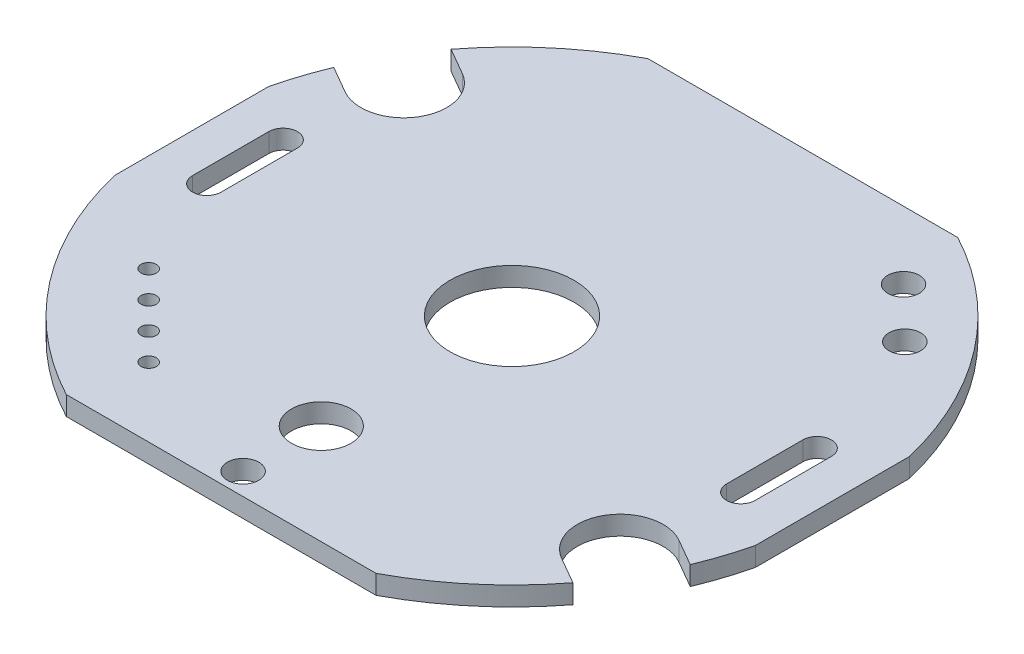
ISO-10303-21;
HEADER;
FILE_DESCRIPTION(('STEP AP214'),'2;1');
FILE_NAME('part.step','',(''),(''),'','','');
FILE_SCHEMA(('AUTOMOTIVE_DESIGN { 1 0 10303 214 1 1 1 1 }'));
ENDSEC;
DATA;
#1=APPLICATION_CONTEXT('core data for automotive mechanical design processes');
#2=APPLICATION_PROTOCOL_DEFINITION('international standard','automotive_design',2000,#1);
#3=PRODUCT_CONTEXT('',#1,'mechanical');
#4=PRODUCT('Part','Part','',(#3));
#5=PRODUCT_RELATED_PRODUCT_CATEGORY('part','',(#4));
#6=PRODUCT_DEFINITION_FORMATION('','',#4);
#7=PRODUCT_DEFINITION_CONTEXT('part definition',#1,'design');
#8=PRODUCT_DEFINITION('design','',#6,#7);
#9=PRODUCT_DEFINITION_SHAPE('','',#8);
#10=(LENGTH_UNIT() NAMED_UNIT(*) SI_UNIT(.MILLI.,.METRE.));
#11=(NAMED_UNIT(*) PLANE_ANGLE_UNIT() SI_UNIT($,.RADIAN.));
#12=(NAMED_UNIT(*) SI_UNIT($,.STERADIAN.) SOLID_ANGLE_UNIT());
#13=UNCERTAINTY_MEASURE_WITH_UNIT(LENGTH_MEASURE(1.E-05),#10,'distance_accuracy_value','');
#14=(GEOMETRIC_REPRESENTATION_CONTEXT(3) GLOBAL_UNCERTAINTY_ASSIGNED_CONTEXT((#13)) GLOBAL_UNIT_ASSIGNED_CONTEXT((#10,
#11,#12)) REPRESENTATION_CONTEXT('',''));
#15=CARTESIAN_POINT('',(0.,0.,0.));
#16=DIRECTION('',(0.,0.,1.));
#17=DIRECTION('',(1.,0.,0.));
#18=AXIS2_PLACEMENT_3D('',#15,#16,#17);
#19=CARTESIAN_POINT('',(16.8005,0.,-15.2505));
#20=DIRECTION('',(0.,1.,0.));
#21=DIRECTION('',(0.,0.,1.));
#22=AXIS2_PLACEMENT_3D('',#19,#20,#21);
#23=PLANE('',#22);
#24=CARTESIAN_POINT('',(2.8,0.,-17.25));
#25=DIRECTION('',(0.,-1.,0.));
#26=DIRECTION('',(0.,0.,-1.));
#27=AXIS2_PLACEMENT_3D('',#24,#25,#26);
#28=CIRCLE('',#27,0.750000000000001);
#29=CARTESIAN_POINT('',(3.55,0.,-17.25));
#30=VERTEX_POINT('',#29);
#31=CARTESIAN_POINT('',(2.05,0.,-17.25));
#32=VERTEX_POINT('',#31);
#33=EDGE_CURVE('E310',#30,#32,#28,.F.);
#34=ORIENTED_EDGE('',*,*,#33,.T.);
#35=DIRECTION('',(0.,0.,-1.));
#36=VECTOR('',#35,1.);
#37=CARTESIAN_POINT('',(2.05,0.,-17.25));
#38=LINE('',#37,#36);
#39=CARTESIAN_POINT('',(2.05,0.,-13.25));
#40=VERTEX_POINT('',#39);
#41=EDGE_CURVE('E317',#40,#32,#38,.T.);
#42=ORIENTED_EDGE('',*,*,#41,.F.);
#43=CARTESIAN_POINT('',(2.8,0.,-13.25));
#44=DIRECTION('',(0.,-1.,0.));
#45=DIRECTION('',(0.,0.,-1.));
#46=AXIS2_PLACEMENT_3D('',#43,#44,#45);
#47=CIRCLE('',#46,0.750000000000001);
#48=CARTESIAN_POINT('',(3.55,0.,-13.25));
#49=VERTEX_POINT('',#48);
#50=EDGE_CURVE('E306',#40,#49,#47,.F.);
#51=ORIENTED_EDGE('',*,*,#50,.T.);
#52=DIRECTION('',(0.,0.,1.));
#53=VECTOR('',#52,1.);
#54=CARTESIAN_POINT('',(3.55,0.,-17.25));
#55=LINE('',#54,#53);
#56=EDGE_CURVE('E312',#30,#49,#55,.T.);
#57=ORIENTED_EDGE('',*,*,#56,.F.);
#58=EDGE_LOOP('',(#34,#42,#51,#57));
#59=FACE_BOUND('',#58,.T.);
#60=CARTESIAN_POINT('',(9.3713,0.,-3.6287));
#61=DIRECTION('',(0.,-1.,0.));
#62=DIRECTION('',(0.,0.,-1.));
#63=AXIS2_PLACEMENT_3D('',#60,#61,#62);
#64=CIRCLE('',#63,0.4);
#65=CARTESIAN_POINT('',(9.3713,0.,-4.0287));
#66=VERTEX_POINT('',#65);
#67=EDGE_CURVE('E322',#66,#66,#64,.F.);
#68=ORIENTED_EDGE('',*,*,#67,.T.);
#69=EDGE_LOOP('',(#68));
#70=FACE_BOUND('',#69,.T.);
#71=CARTESIAN_POINT('',(7.9571,0.,-5.0429));
#72=DIRECTION('',(0.,-1.,0.));
#73=DIRECTION('',(0.,0.,-1.));
#74=AXIS2_PLACEMENT_3D('',#71,#72,#73);
#75=CIRCLE('',#74,0.399999999999999);
#76=CARTESIAN_POINT('',(7.9571,0.,-5.4429));
#77=VERTEX_POINT('',#76);
#78=EDGE_CURVE('E19',#77,#77,#75,.F.);
#79=ORIENTED_EDGE('',*,*,#78,.T.);
#80=EDGE_LOOP('',(#79));
#81=FACE_BOUND('',#80,.T.);
#82=CARTESIAN_POINT('',(6.5429,0.,-6.4571));
#83=DIRECTION('',(0.,-1.,0.));
#84=DIRECTION('',(0.,0.,-1.));
#85=AXIS2_PLACEMENT_3D('',#82,#83,#84);
#86=CIRCLE('',#85,0.4);
#87=CARTESIAN_POINT('',(6.5429,0.,-6.8571));
#88=VERTEX_POINT('',#87);
#89=EDGE_CURVE('E326',#88,#88,#86,.F.);
#90=ORIENTED_EDGE('',*,*,#89,.T.);
#91=EDGE_LOOP('',(#90));
#92=FACE_BOUND('',#91,.T.);
#93=CARTESIAN_POINT('',(5.1287,0.,-7.8713));
#94=DIRECTION('',(0.,-1.,0.));
#95=DIRECTION('',(0.,0.,-1.));
#96=AXIS2_PLACEMENT_3D('',#93,#94,#95);
#97=CIRCLE('',#96,0.399999999999999);
#98=CARTESIAN_POINT('',(5.1287,0.,-8.2713));
#99=VERTEX_POINT('',#98);
#100=EDGE_CURVE('E352',#99,#99,#97,.F.);
#101=ORIENTED_EDGE('',*,*,#100,.T.);
#102=EDGE_LOOP('',(#101));
#103=FACE_BOUND('',#102,.T.);
#104=CARTESIAN_POINT('',(28.269335274221,0.,-24.3788193190534));
#105=DIRECTION('',(0.,-1.,0.));
#106=DIRECTION('',(0.,0.,-1.));
#107=AXIS2_PLACEMENT_3D('',#104,#105,#106);
#108=CIRCLE('',#107,0.824999999999999);
#109=CARTESIAN_POINT('',(28.269335274221,0.,-25.2038193190534));
#110=VERTEX_POINT('',#109);
#111=EDGE_CURVE('E329',#110,#110,#108,.F.);
#112=ORIENTED_EDGE('',*,*,#111,.T.);
#113=EDGE_LOOP('',(#112));
#114=FACE_BOUND('',#113,.T.);
#115=CARTESIAN_POINT('',(25.6262960708677,0.,-26.9537354438111));
#116=DIRECTION('',(0.,-1.,0.));
#117=DIRECTION('',(0.,0.,-1.));
#118=AXIS2_PLACEMENT_3D('',#115,#116,#117);
#119=CIRCLE('',#118,0.824999999999996);
#120=CARTESIAN_POINT('',(25.6262960708677,0.,-27.7787354438111));
#121=VERTEX_POINT('',#120);
#122=EDGE_CURVE('E350',#121,#121,#119,.F.);
#123=ORIENTED_EDGE('',*,*,#122,.T.);
#124=EDGE_LOOP('',(#123));
#125=FACE_BOUND('',#124,.T.);
#126=CARTESIAN_POINT('',(16.8,0.,-1.1509));
#127=DIRECTION('',(0.,-1.,0.));
#128=DIRECTION('',(0.,0.,-1.));
#129=AXIS2_PLACEMENT_3D('',#126,#127,#128);
#130=CIRCLE('',#129,0.8255);
#131=CARTESIAN_POINT('',(16.8,0.,-1.9764));
#132=VERTEX_POINT('',#131);
#133=EDGE_CURVE('E202',#132,#132,#130,.F.);
#134=ORIENTED_EDGE('',*,*,#133,.T.);
#135=EDGE_LOOP('',(#134));
#136=FACE_BOUND('',#135,.T.);
#137=CARTESIAN_POINT('',(16.8005,0.,-5.2506));
#138=DIRECTION('',(0.,-1.,0.));
#139=DIRECTION('',(0.,0.,-1.));
#140=AXIS2_PLACEMENT_3D('',#137,#138,#139);
#141=CIRCLE('',#140,1.5621);
#142=CARTESIAN_POINT('',(16.8005,0.,-6.8127));
#143=VERTEX_POINT('',#142);
#144=EDGE_CURVE('E186',#143,#143,#141,.F.);
#145=ORIENTED_EDGE('',*,*,#144,.T.);
#146=EDGE_LOOP('',(#145));
#147=FACE_BOUND('',#146,.T.);
#148=CARTESIAN_POINT('',(16.8005,0.,-15.2505));
#149=DIRECTION('',(0.,-1.,0.));
#150=DIRECTION('',(0.,0.,-1.));
#151=AXIS2_PLACEMENT_3D('',#148,#149,#150);
#152=CIRCLE('',#151,3.2512);
#153=CARTESIAN_POINT('',(16.8005,0.,-18.5017));
#154=VERTEX_POINT('',#153);
#155=EDGE_CURVE('E199',#154,#154,#152,.F.);
#156=ORIENTED_EDGE('',*,*,#155,.T.);
#157=EDGE_LOOP('',(#156));
#158=FACE_BOUND('',#157,.T.);
#159=DIRECTION('',(1.,0.,0.));
#160=VECTOR('',#159,1.);
#161=CARTESIAN_POINT('',(8.67927374070246,0.,-30.5007));
#162=LINE('',#161,#160);
#163=CARTESIAN_POINT('',(8.67927374070246,0.,-30.5007));
#164=VERTEX_POINT('',#163);
#165=CARTESIAN_POINT('',(24.9217262592976,0.,-30.5007));
#166=VERTEX_POINT('',#165);
#167=EDGE_CURVE('E179',#164,#166,#162,.T.);
#168=ORIENTED_EDGE('',*,*,#167,.T.);
#169=CARTESIAN_POINT('',(16.8005,0.,-15.2505));
#170=DIRECTION('',(0.,-1.,0.));
#171=DIRECTION('',(0.,0.,-1.));
#172=AXIS2_PLACEMENT_3D('',#169,#170,#171);
#173=CIRCLE('',#172,17.277815718276);
#174=CARTESIAN_POINT('',(33.6001,0.,-19.2873745131233));
#175=VERTEX_POINT('',#174);
#176=EDGE_CURVE('E211',#175,#166,#173,.F.);
#177=ORIENTED_EDGE('',*,*,#176,.F.);
#178=DIRECTION('',(0.,0.,1.));
#179=VECTOR('',#178,1.);
#180=CARTESIAN_POINT('',(33.6001,0.,-19.2873745131233));
#181=LINE('',#180,#179);
#182=CARTESIAN_POINT('',(33.6001,0.,-11.2136254868767));
#183=VERTEX_POINT('',#182);
#184=EDGE_CURVE('E208',#175,#183,#181,.T.);
#185=ORIENTED_EDGE('',*,*,#184,.T.);
#186=CARTESIAN_POINT('',(16.8005,0.,-15.2505));
#187=DIRECTION('',(0.,-1.,0.));
#188=DIRECTION('',(0.,0.,-1.));
#189=AXIS2_PLACEMENT_3D('',#186,#187,#188);
#190=CIRCLE('',#189,17.277815718276);
#191=CARTESIAN_POINT('',(32.7617691427317,0.,-8.63530511640165));
#192=VERTEX_POINT('',#191);
#193=EDGE_CURVE('E216',#192,#183,#190,.F.);
#194=ORIENTED_EDGE('',*,*,#193,.F.);
#195=DIRECTION('',(-0.866030773137072,0.,-0.499990699893113));
#196=VECTOR('',#195,1.);
#197=CARTESIAN_POINT('',(31.3526109768806,0.,-9.44886278601168));
#198=LINE('',#197,#196);
#199=CARTESIAN_POINT('',(31.3526109768806,0.,-9.44886278601168));
#200=VERTEX_POINT('',#199);
#201=EDGE_CURVE('E213',#192,#200,#198,.T.);
#202=ORIENTED_EDGE('',*,*,#201,.T.);
#203=CARTESIAN_POINT('',(30.2268700211117,0.,-7.49897389710827));
#204=DIRECTION('',(0.,-1.,0.));
#205=DIRECTION('',(0.,0.,-1.));
#206=AXIS2_PLACEMENT_3D('',#203,#204,#205);
#207=CIRCLE('',#206,2.25152379036166);
#208=CARTESIAN_POINT('',(29.1011290653428,0.,-5.54908500820485));
#209=VERTEX_POINT('',#208);
#210=EDGE_CURVE('E338',#200,#209,#207,.F.);
#211=ORIENTED_EDGE('',*,*,#210,.T.);
#212=DIRECTION('',(0.866030773137073,0.,0.499990699893112));
#213=VECTOR('',#212,1.);
#214=CARTESIAN_POINT('',(29.1011290653428,0.,-5.54908500820485));
#215=LINE('',#214,#213);
#216=CARTESIAN_POINT('',(30.5102872311938,0.,-4.73552733859481));
#217=VERTEX_POINT('',#216);
#218=EDGE_CURVE('E218',#209,#217,#215,.T.);
#219=ORIENTED_EDGE('',*,*,#218,.T.);
#220=CARTESIAN_POINT('',(16.8005,0.,-15.2505));
#221=DIRECTION('',(0.,-1.,0.));
#222=DIRECTION('',(0.,0.,-1.));
#223=AXIS2_PLACEMENT_3D('',#220,#221,#222);
#224=CIRCLE('',#223,17.277815718276);
#225=CARTESIAN_POINT('',(24.9217262592975,0.,-0.000299999999999953));
#226=VERTEX_POINT('',#225);
#227=EDGE_CURVE('E226',#226,#217,#224,.F.);
#228=ORIENTED_EDGE('',*,*,#227,.F.);
#229=DIRECTION('',(-1.,0.,0.));
#230=VECTOR('',#229,1.);
#231=CARTESIAN_POINT('',(24.9217262592975,0.,-0.000299999999999953));
#232=LINE('',#231,#230);
#233=CARTESIAN_POINT('',(8.67927374070247,0.,-0.000299999999999953));
#234=VERTEX_POINT('',#233);
#235=EDGE_CURVE('E223',#226,#234,#232,.T.);
#236=ORIENTED_EDGE('',*,*,#235,.T.);
#237=CARTESIAN_POINT('',(16.8005,0.,-15.2505));
#238=DIRECTION('',(0.,-1.,0.));
#239=DIRECTION('',(0.,0.,-1.));
#240=AXIS2_PLACEMENT_3D('',#237,#238,#239);
#241=CIRCLE('',#240,17.277815718276);
#242=CARTESIAN_POINT('',(0.000900000000001594,0.,-11.2136254868768));
#243=VERTEX_POINT('',#242);
#244=EDGE_CURVE('E231',#243,#234,#241,.F.);
#245=ORIENTED_EDGE('',*,*,#244,.F.);
#246=DIRECTION('',(0.,0.,-1.));
#247=VECTOR('',#246,1.);
#248=CARTESIAN_POINT('',(0.000900000000001594,0.,-19.2873745131232));
#249=LINE('',#248,#247);
#250=CARTESIAN_POINT('',(0.000900000000001594,0.,-19.2873745131232));
#251=VERTEX_POINT('',#250);
#252=EDGE_CURVE('E228',#243,#251,#249,.T.);
#253=ORIENTED_EDGE('',*,*,#252,.T.);
#254=CARTESIAN_POINT('',(16.8005,0.,-15.2505));
#255=DIRECTION('',(0.,-1.,0.));
#256=DIRECTION('',(0.,0.,-1.));
#257=AXIS2_PLACEMENT_3D('',#254,#255,#256);
#258=CIRCLE('',#257,17.277815718276);
#259=CARTESIAN_POINT('',(0.839230857268334,0.,-21.8656948835984));
#260=VERTEX_POINT('',#259);
#261=EDGE_CURVE('E236',#260,#251,#258,.F.);
#262=ORIENTED_EDGE('',*,*,#261,.F.);
#263=DIRECTION('',(0.866030773137072,0.,0.499990699893114));
#264=VECTOR('',#263,1.);
#265=CARTESIAN_POINT('',(2.24838902311941,0.,-21.0521372139883));
#266=LINE('',#265,#264);
#267=CARTESIAN_POINT('',(2.24838902311941,0.,-21.0521372139883));
#268=VERTEX_POINT('',#267);
#269=EDGE_CURVE('E233',#260,#268,#266,.T.);
#270=ORIENTED_EDGE('',*,*,#269,.T.);
#271=CARTESIAN_POINT('',(3.37412997888833,0.,-23.0020261028917));
#272=DIRECTION('',(0.,-1.,0.));
#273=DIRECTION('',(0.,0.,-1.));
#274=AXIS2_PLACEMENT_3D('',#271,#272,#273);
#275=CIRCLE('',#274,2.25152379036166);
#276=CARTESIAN_POINT('',(4.49987093465725,0.,-24.9519149917952));
#277=VERTEX_POINT('',#276);
#278=EDGE_CURVE('E346',#268,#277,#275,.F.);
#279=ORIENTED_EDGE('',*,*,#278,.T.);
#280=DIRECTION('',(-0.866030773137076,0.,-0.499990699893107));
#281=VECTOR('',#280,1.);
#282=CARTESIAN_POINT('',(4.49987093465726,0.,-24.9519149917952));
#283=LINE('',#282,#281);
#284=CARTESIAN_POINT('',(3.09071276880618,0.,-25.7654726614052));
#285=VERTEX_POINT('',#284);
#286=EDGE_CURVE('E182',#277,#285,#283,.T.);
#287=ORIENTED_EDGE('',*,*,#286,.T.);
#288=CARTESIAN_POINT('',(16.8005,0.,-15.2505));
#289=DIRECTION('',(0.,-1.,0.));
#290=DIRECTION('',(0.,0.,-1.));
#291=AXIS2_PLACEMENT_3D('',#288,#289,#290);
#292=CIRCLE('',#291,17.277815718276);
#293=EDGE_CURVE('E175',#164,#285,#292,.F.);
#294=ORIENTED_EDGE('',*,*,#293,.F.);
#295=EDGE_LOOP('',(#168,#177,#185,#194,#202,#211,#219,#228,#236,#245,#253,#262,#270,#279,#287,#294));
#296=FACE_BOUND('',#295,.T.);
#297=CARTESIAN_POINT('',(30.8,0.,-17.25));
#298=DIRECTION('',(0.,-1.,0.));
#299=DIRECTION('',(0.,0.,-1.));
#300=AXIS2_PLACEMENT_3D('',#297,#298,#299);
#301=CIRCLE('',#300,0.750000000000004);
#302=CARTESIAN_POINT('',(31.55,0.,-17.25));
#303=VERTEX_POINT('',#302);
#304=CARTESIAN_POINT('',(30.05,0.,-17.25));
#305=VERTEX_POINT('',#304);
#306=EDGE_CURVE('E319',#303,#305,#301,.F.);
#307=ORIENTED_EDGE('',*,*,#306,.T.);
#308=DIRECTION('',(0.,0.,-1.));
#309=VECTOR('',#308,1.);
#310=CARTESIAN_POINT('',(30.05,0.,-17.25));
#311=LINE('',#310,#309);
#312=CARTESIAN_POINT('',(30.05,0.,-13.25));
#313=VERTEX_POINT('',#312);
#314=EDGE_CURVE('E325',#313,#305,#311,.T.);
#315=ORIENTED_EDGE('',*,*,#314,.F.);
#316=CARTESIAN_POINT('',(30.8,0.,-13.25));
#317=DIRECTION('',(0.,-1.,0.));
#318=DIRECTION('',(0.,0.,-1.));
#319=AXIS2_PLACEMENT_3D('',#316,#317,#318);
#320=CIRCLE('',#319,0.750000000000004);
#321=CARTESIAN_POINT('',(31.55,0.,-13.25));
#322=VERTEX_POINT('',#321);
#323=EDGE_CURVE('E314',#313,#322,#320,.F.);
#324=ORIENTED_EDGE('',*,*,#323,.T.);
#325=DIRECTION('',(0.,0.,1.));
#326=VECTOR('',#325,1.);
#327=CARTESIAN_POINT('',(31.55,0.,-17.25));
#328=LINE('',#327,#326);
#329=EDGE_CURVE('E206',#303,#322,#328,.T.);
#330=ORIENTED_EDGE('',*,*,#329,.F.);
#331=EDGE_LOOP('',(#307,#315,#324,#330));
#332=FACE_BOUND('',#331,.T.);
#333=ADVANCED_FACE('F16',(#59,#70,#81,#92,#103,#114,#125,#136,#147,#158,#296,#332),#23,.F.);
#334=CARTESIAN_POINT('',(7.9571,1.,-5.0429));
#335=DIRECTION('',(0.,-1.,0.));
#336=DIRECTION('',(0.,0.,-1.));
#337=AXIS2_PLACEMENT_3D('',#334,#335,#336);
#338=CYLINDRICAL_SURFACE('',#337,0.399999999999999);
#339=CARTESIAN_POINT('',(7.9571,1.,-5.0429));
#340=DIRECTION('',(0.,-1.,0.));
#341=DIRECTION('',(0.,0.,-1.));
#342=AXIS2_PLACEMENT_3D('',#339,#340,#341);
#343=CIRCLE('',#342,0.399999999999999);
#344=CARTESIAN_POINT('',(7.9571,1.,-5.4429));
#345=VERTEX_POINT('',#344);
#346=EDGE_CURVE('E303',#345,#345,#343,.T.);
#347=ORIENTED_EDGE('',*,*,#346,.F.);
#348=EDGE_LOOP('',(#347));
#349=FACE_BOUND('',#348,.T.);
#350=ORIENTED_EDGE('',*,*,#78,.F.);
#351=EDGE_LOOP('',(#350));
#352=FACE_BOUND('',#351,.T.);
#353=ADVANCED_FACE('F361',(#349,#352),#338,.F.);
#354=CARTESIAN_POINT('',(5.1287,1.,-7.8713));
#355=DIRECTION('',(0.,-1.,0.));
#356=DIRECTION('',(0.,0.,-1.));
#357=AXIS2_PLACEMENT_3D('',#354,#355,#356);
#358=CYLINDRICAL_SURFACE('',#357,0.399999999999999);
#359=CARTESIAN_POINT('',(5.1287,1.,-7.8713));
#360=DIRECTION('',(0.,-1.,0.));
#361=DIRECTION('',(0.,0.,-1.));
#362=AXIS2_PLACEMENT_3D('',#359,#360,#361);
#363=CIRCLE('',#362,0.399999999999999);
#364=CARTESIAN_POINT('',(5.1287,1.,-8.2713));
#365=VERTEX_POINT('',#364);
#366=EDGE_CURVE('E300',#365,#365,#363,.T.);
#367=ORIENTED_EDGE('',*,*,#366,.F.);
#368=EDGE_LOOP('',(#367));
#369=FACE_BOUND('',#368,.T.);
#370=ORIENTED_EDGE('',*,*,#100,.F.);
#371=EDGE_LOOP('',(#370));
#372=FACE_BOUND('',#371,.T.);
#373=ADVANCED_FACE('F363',(#369,#372),#358,.F.);
#374=CARTESIAN_POINT('',(25.6262960708677,1.,-26.9537354438111));
#375=DIRECTION('',(0.,-1.,0.));
#376=DIRECTION('',(0.,0.,-1.));
#377=AXIS2_PLACEMENT_3D('',#374,#375,#376);
#378=CYLINDRICAL_SURFACE('',#377,0.824999999999996);
#379=CARTESIAN_POINT('',(25.6262960708677,1.,-26.9537354438111));
#380=DIRECTION('',(0.,-1.,0.));
#381=DIRECTION('',(0.,0.,-1.));
#382=AXIS2_PLACEMENT_3D('',#379,#380,#381);
#383=CIRCLE('',#382,0.824999999999996);
#384=CARTESIAN_POINT('',(25.6262960708677,1.,-27.7787354438111));
#385=VERTEX_POINT('',#384);
#386=EDGE_CURVE('E297',#385,#385,#383,.T.);
#387=ORIENTED_EDGE('',*,*,#386,.F.);
#388=EDGE_LOOP('',(#387));
#389=FACE_BOUND('',#388,.T.);
#390=ORIENTED_EDGE('',*,*,#122,.F.);
#391=EDGE_LOOP('',(#390));
#392=FACE_BOUND('',#391,.T.);
#393=ADVANCED_FACE('F370',(#389,#392),#378,.F.);
#394=CARTESIAN_POINT('',(16.8005,1.,-5.2506));
#395=DIRECTION('',(0.,-1.,0.));
#396=DIRECTION('',(0.,0.,-1.));
#397=AXIS2_PLACEMENT_3D('',#394,#395,#396);
#398=CYLINDRICAL_SURFACE('',#397,1.5621);
#399=CARTESIAN_POINT('',(16.8005,1.,-5.2506));
#400=DIRECTION('',(0.,-1.,0.));
#401=DIRECTION('',(0.,0.,-1.));
#402=AXIS2_PLACEMENT_3D('',#399,#400,#401);
#403=CIRCLE('',#402,1.5621);
#404=CARTESIAN_POINT('',(16.8005,1.,-6.8127));
#405=VERTEX_POINT('',#404);
#406=EDGE_CURVE('E294',#405,#405,#403,.T.);
#407=ORIENTED_EDGE('',*,*,#406,.F.);
#408=EDGE_LOOP('',(#407));
#409=FACE_BOUND('',#408,.T.);
#410=ORIENTED_EDGE('',*,*,#144,.F.);
#411=EDGE_LOOP('',(#410));
#412=FACE_BOUND('',#411,.T.);
#413=ADVANCED_FACE('F495',(#409,#412),#398,.F.);
#414=CARTESIAN_POINT('',(16.8005,1.,-15.2505));
#415=DIRECTION('',(0.,-1.,0.));
#416=DIRECTION('',(0.,0.,-1.));
#417=AXIS2_PLACEMENT_3D('',#414,#415,#416);
#418=CYLINDRICAL_SURFACE('',#417,17.277815718276);
#419=CARTESIAN_POINT('',(16.8005,1.,-15.2505));
#420=DIRECTION('',(0.,-1.,0.));
#421=DIRECTION('',(0.,0.,-1.));
#422=AXIS2_PLACEMENT_3D('',#419,#420,#421);
#423=CIRCLE('',#422,17.277815718276);
#424=CARTESIAN_POINT('',(8.67927374070246,1.,-30.5007));
#425=VERTEX_POINT('',#424);
#426=CARTESIAN_POINT('',(3.09071276880617,1.,-25.7654726614052));
#427=VERTEX_POINT('',#426);
#428=EDGE_CURVE('E192',#425,#427,#423,.F.);
#429=ORIENTED_EDGE('',*,*,#428,.F.);
#430=DIRECTION('',(0.,1.,0.));
#431=VECTOR('',#430,1.);
#432=CARTESIAN_POINT('',(8.67927374070246,1.,-30.5007));
#433=LINE('',#432,#431);
#434=EDGE_CURVE('E189',#425,#164,#433,.F.);
#435=ORIENTED_EDGE('',*,*,#434,.T.);
#436=ORIENTED_EDGE('',*,*,#293,.T.);
#437=DIRECTION('',(0.,1.,0.));
#438=VECTOR('',#437,1.);
#439=CARTESIAN_POINT('',(3.09071276880618,1.,-25.7654726614052));
#440=LINE('',#439,#438);
#441=EDGE_CURVE('E185',#285,#427,#440,.T.);
#442=ORIENTED_EDGE('',*,*,#441,.T.);
#443=EDGE_LOOP('',(#429,#435,#436,#442));
#444=FACE_BOUND('',#443,.T.);
#445=ADVANCED_FACE('F190',(#444),#418,.T.);
#446=CARTESIAN_POINT('',(4.49987093465726,1.,-24.9519149917952));
#447=DIRECTION('',(0.499990699893107,0.,-0.866030773137076));
#448=DIRECTION('',(-0.866030773137076,0.,-0.499990699893107));
#449=AXIS2_PLACEMENT_3D('',#446,#447,#448);
#450=PLANE('',#449);
#451=DIRECTION('',(0.,-1.,0.));
#452=VECTOR('',#451,1.);
#453=CARTESIAN_POINT('',(4.49987093465726,1.,-24.9519149917952));
#454=LINE('',#453,#452);
#455=CARTESIAN_POINT('',(4.49987093465725,1.,-24.9519149917952));
#456=VERTEX_POINT('',#455);
#457=EDGE_CURVE('E238',#277,#456,#454,.F.);
#458=ORIENTED_EDGE('',*,*,#457,.T.);
#459=DIRECTION('',(0.866030773137077,0.,0.499990699893105));
#460=VECTOR('',#459,1.);
#461=CARTESIAN_POINT('',(3.09071276880617,1.,-25.7654726614052));
#462=LINE('',#461,#460);
#463=EDGE_CURVE('E292',#427,#456,#462,.T.);
#464=ORIENTED_EDGE('',*,*,#463,.F.);
#465=ORIENTED_EDGE('',*,*,#441,.F.);
#466=ORIENTED_EDGE('',*,*,#286,.F.);
#467=EDGE_LOOP('',(#458,#464,#465,#466));
#468=FACE_BOUND('',#467,.T.);
#469=ADVANCED_FACE('F488',(#468),#450,.F.);
#470=CARTESIAN_POINT('',(3.37412997888833,1.,-23.0020261028917));
#471=DIRECTION('',(0.,-1.,0.));
#472=DIRECTION('',(0.,0.,-1.));
#473=AXIS2_PLACEMENT_3D('',#470,#471,#472);
#474=CYLINDRICAL_SURFACE('',#473,2.25152379036166);
#475=DIRECTION('',(0.,1.,0.));
#476=VECTOR('',#475,1.);
#477=CARTESIAN_POINT('',(2.24838902311941,1.,-21.0521372139883));
#478=LINE('',#477,#476);
#479=CARTESIAN_POINT('',(2.24838902311941,1.,-21.0521372139883));
#480=VERTEX_POINT('',#479);
#481=EDGE_CURVE('E237',#268,#480,#478,.T.);
#482=ORIENTED_EDGE('',*,*,#481,.T.);
#483=CARTESIAN_POINT('',(3.37412997888833,1.,-23.0020261028917));
#484=DIRECTION('',(0.,-1.,0.));
#485=DIRECTION('',(0.,0.,-1.));
#486=AXIS2_PLACEMENT_3D('',#483,#484,#485);
#487=CIRCLE('',#486,2.25152379036166);
#488=EDGE_CURVE('E289',#456,#480,#487,.T.);
#489=ORIENTED_EDGE('',*,*,#488,.F.);
#490=ORIENTED_EDGE('',*,*,#457,.F.);
#491=ORIENTED_EDGE('',*,*,#278,.F.);
#492=EDGE_LOOP('',(#482,#489,#490,#491));
#493=FACE_BOUND('',#492,.T.);
#494=ADVANCED_FACE('F484',(#493),#474,.F.);
#495=CARTESIAN_POINT('',(2.24838902311941,1.,-21.0521372139883));
#496=DIRECTION('',(-0.499990699893114,0.,0.866030773137072));
#497=DIRECTION('',(0.866030773137072,0.,0.499990699893114));
#498=AXIS2_PLACEMENT_3D('',#495,#496,#497);
#499=PLANE('',#498);
#500=DIRECTION('',(0.,-1.,0.));
#501=VECTOR('',#500,1.);
#502=CARTESIAN_POINT('',(0.839230857268333,1.,-21.8656948835983));
#503=LINE('',#502,#501);
#504=CARTESIAN_POINT('',(0.839230857268333,1.,-21.8656948835984));
#505=VERTEX_POINT('',#504);
#506=EDGE_CURVE('E345',#505,#260,#503,.T.);
#507=ORIENTED_EDGE('',*,*,#506,.F.);
#508=DIRECTION('',(-0.866030773137072,0.,-0.499990699893113));
#509=VECTOR('',#508,1.);
#510=CARTESIAN_POINT('',(2.24838902311941,1.,-21.0521372139883));
#511=LINE('',#510,#509);
#512=EDGE_CURVE('E288',#480,#505,#511,.T.);
#513=ORIENTED_EDGE('',*,*,#512,.F.);
#514=ORIENTED_EDGE('',*,*,#481,.F.);
#515=ORIENTED_EDGE('',*,*,#269,.F.);
#516=EDGE_LOOP('',(#507,#513,#514,#515));
#517=FACE_BOUND('',#516,.T.);
#518=ADVANCED_FACE('F480',(#517),#499,.F.);
#519=CARTESIAN_POINT('',(16.8005,1.,-15.2505));
#520=DIRECTION('',(0.,-1.,0.));
#521=DIRECTION('',(0.,0.,-1.));
#522=AXIS2_PLACEMENT_3D('',#519,#520,#521);
#523=CYLINDRICAL_SURFACE('',#522,17.277815718276);
#524=CARTESIAN_POINT('',(16.8005,1.,-15.2505));
#525=DIRECTION('',(0.,-1.,0.));
#526=DIRECTION('',(0.,0.,-1.));
#527=AXIS2_PLACEMENT_3D('',#524,#525,#526);
#528=CIRCLE('',#527,17.277815718276);
#529=CARTESIAN_POINT('',(0.000900000000001594,1.,-19.2873745131232));
#530=VERTEX_POINT('',#529);
#531=EDGE_CURVE('E285',#505,#530,#528,.F.);
#532=ORIENTED_EDGE('',*,*,#531,.F.);
#533=ORIENTED_EDGE('',*,*,#506,.T.);
#534=ORIENTED_EDGE('',*,*,#261,.T.);
#535=DIRECTION('',(0.,1.,0.));
#536=VECTOR('',#535,1.);
#537=CARTESIAN_POINT('',(0.000900000000001594,1.,-19.2873745131232));
#538=LINE('',#537,#536);
#539=EDGE_CURVE('E232',#251,#530,#538,.T.);
#540=ORIENTED_EDGE('',*,*,#539,.T.);
#541=EDGE_LOOP('',(#532,#533,#534,#540));
#542=FACE_BOUND('',#541,.T.);
#543=ADVANCED_FACE('F476',(#542),#523,.T.);
#544=CARTESIAN_POINT('',(0.000900000000001594,1.,-19.2873745131232));
#545=DIRECTION('',(1.,0.,0.));
#546=DIRECTION('',(0.,0.,-1.));
#547=AXIS2_PLACEMENT_3D('',#544,#545,#546);
#548=PLANE('',#547);
#549=DIRECTION('',(0.,-1.,0.));
#550=VECTOR('',#549,1.);
#551=CARTESIAN_POINT('',(0.000900000000001594,1.,-11.2136254868768));
#552=LINE('',#551,#550);
#553=CARTESIAN_POINT('',(0.000900000000001594,1.,-11.2136254868768));
#554=VERTEX_POINT('',#553);
#555=EDGE_CURVE('E343',#554,#243,#552,.T.);
#556=ORIENTED_EDGE('',*,*,#555,.F.);
#557=DIRECTION('',(0.,0.,1.));
#558=VECTOR('',#557,1.);
#559=CARTESIAN_POINT('',(0.000900000000001594,1.,-15.2505));
#560=LINE('',#559,#558);
#561=EDGE_CURVE('E284',#530,#554,#560,.T.);
#562=ORIENTED_EDGE('',*,*,#561,.F.);
#563=ORIENTED_EDGE('',*,*,#539,.F.);
#564=ORIENTED_EDGE('',*,*,#252,.F.);
#565=EDGE_LOOP('',(#556,#562,#563,#564));
#566=FACE_BOUND('',#565,.T.);
#567=ADVANCED_FACE('F472',(#566),#548,.F.);
#568=CARTESIAN_POINT('',(16.8005,1.,-15.2505));
#569=DIRECTION('',(0.,-1.,0.));
#570=DIRECTION('',(0.,0.,-1.));
#571=AXIS2_PLACEMENT_3D('',#568,#569,#570);
#572=CYLINDRICAL_SURFACE('',#571,17.277815718276);
#573=CARTESIAN_POINT('',(16.8005,1.,-15.2505));
#574=DIRECTION('',(0.,-1.,0.));
#575=DIRECTION('',(0.,0.,-1.));
#576=AXIS2_PLACEMENT_3D('',#573,#574,#575);
#577=CIRCLE('',#576,17.277815718276);
#578=CARTESIAN_POINT('',(8.67927374070247,1.,-0.000299999999999953));
#579=VERTEX_POINT('',#578);
#580=EDGE_CURVE('E281',#554,#579,#577,.F.);
#581=ORIENTED_EDGE('',*,*,#580,.F.);
#582=ORIENTED_EDGE('',*,*,#555,.T.);
#583=ORIENTED_EDGE('',*,*,#244,.T.);
#584=DIRECTION('',(0.,1.,0.));
#585=VECTOR('',#584,1.);
#586=CARTESIAN_POINT('',(8.67927374070247,1.,-0.000299999999999953));
#587=LINE('',#586,#585);
#588=EDGE_CURVE('E227',#234,#579,#587,.T.);
#589=ORIENTED_EDGE('',*,*,#588,.T.);
#590=EDGE_LOOP('',(#581,#582,#583,#589));
#591=FACE_BOUND('',#590,.T.);
#592=ADVANCED_FACE('F468',(#591),#572,.T.);
#593=CARTESIAN_POINT('',(24.9217262592975,1.,-0.000299999999999953));
#594=DIRECTION('',(0.,0.,-1.));
#595=DIRECTION('',(-1.,0.,0.));
#596=AXIS2_PLACEMENT_3D('',#593,#594,#595);
#597=PLANE('',#596);
#598=DIRECTION('',(0.,-1.,0.));
#599=VECTOR('',#598,1.);
#600=CARTESIAN_POINT('',(24.9217262592975,1.,-0.000299999999999953));
#601=LINE('',#600,#599);
#602=CARTESIAN_POINT('',(24.9217262592975,1.,-0.000299999999999953));
#603=VERTEX_POINT('',#602);
#604=EDGE_CURVE('E341',#603,#226,#601,.T.);
#605=ORIENTED_EDGE('',*,*,#604,.F.);
#606=DIRECTION('',(1.,0.,0.));
#607=VECTOR('',#606,1.);
#608=CARTESIAN_POINT('',(16.8005,1.,-0.000299999999999953));
#609=LINE('',#608,#607);
#610=EDGE_CURVE('E280',#579,#603,#609,.T.);
#611=ORIENTED_EDGE('',*,*,#610,.F.);
#612=ORIENTED_EDGE('',*,*,#588,.F.);
#613=ORIENTED_EDGE('',*,*,#235,.F.);
#614=EDGE_LOOP('',(#605,#611,#612,#613));
#615=FACE_BOUND('',#614,.T.);
#616=ADVANCED_FACE('F464',(#615),#597,.F.);
#617=CARTESIAN_POINT('',(16.8005,1.,-15.2505));
#618=DIRECTION('',(0.,-1.,0.));
#619=DIRECTION('',(0.,0.,-1.));
#620=AXIS2_PLACEMENT_3D('',#617,#618,#619);
#621=CYLINDRICAL_SURFACE('',#620,17.277815718276);
#622=CARTESIAN_POINT('',(16.8005,1.,-15.2505));
#623=DIRECTION('',(0.,-1.,0.));
#624=DIRECTION('',(0.,0.,-1.));
#625=AXIS2_PLACEMENT_3D('',#622,#623,#624);
#626=CIRCLE('',#625,17.277815718276);
#627=CARTESIAN_POINT('',(30.5102872311938,1.,-4.73552733859481));
#628=VERTEX_POINT('',#627);
#629=EDGE_CURVE('E277',#603,#628,#626,.F.);
#630=ORIENTED_EDGE('',*,*,#629,.F.);
#631=ORIENTED_EDGE('',*,*,#604,.T.);
#632=ORIENTED_EDGE('',*,*,#227,.T.);
#633=DIRECTION('',(0.,1.,0.));
#634=VECTOR('',#633,1.);
#635=CARTESIAN_POINT('',(30.5102872311938,1.,-4.73552733859481));
#636=LINE('',#635,#634);
#637=EDGE_CURVE('E222',#217,#628,#636,.T.);
#638=ORIENTED_EDGE('',*,*,#637,.T.);
#639=EDGE_LOOP('',(#630,#631,#632,#638));
#640=FACE_BOUND('',#639,.T.);
#641=ADVANCED_FACE('F460',(#640),#621,.T.);
#642=CARTESIAN_POINT('',(29.1011290653428,1.,-5.54908500820485));
#643=DIRECTION('',(-0.499990699893112,0.,0.866030773137073));
#644=DIRECTION('',(0.866030773137073,0.,0.499990699893112));
#645=AXIS2_PLACEMENT_3D('',#642,#643,#644);
#646=PLANE('',#645);
#647=DIRECTION('',(0.,-1.,0.));
#648=VECTOR('',#647,1.);
#649=CARTESIAN_POINT('',(29.1011290653428,1.,-5.54908500820485));
#650=LINE('',#649,#648);
#651=CARTESIAN_POINT('',(29.1011290653428,1.,-5.54908500820485));
#652=VERTEX_POINT('',#651);
#653=EDGE_CURVE('E221',#209,#652,#650,.F.);
#654=ORIENTED_EDGE('',*,*,#653,.T.);
#655=DIRECTION('',(-0.866030773137071,0.,-0.499990699893115));
#656=VECTOR('',#655,1.);
#657=CARTESIAN_POINT('',(30.5102872311938,1.,-4.73552733859481));
#658=LINE('',#657,#656);
#659=EDGE_CURVE('E276',#628,#652,#658,.T.);
#660=ORIENTED_EDGE('',*,*,#659,.F.);
#661=ORIENTED_EDGE('',*,*,#637,.F.);
#662=ORIENTED_EDGE('',*,*,#218,.F.);
#663=EDGE_LOOP('',(#654,#660,#661,#662));
#664=FACE_BOUND('',#663,.T.);
#665=ADVANCED_FACE('F456',(#664),#646,.F.);
#666=CARTESIAN_POINT('',(30.2268700211117,1.,-7.49897389710827));
#667=DIRECTION('',(0.,-1.,0.));
#668=DIRECTION('',(0.,0.,-1.));
#669=AXIS2_PLACEMENT_3D('',#666,#667,#668);
#670=CYLINDRICAL_SURFACE('',#669,2.25152379036166);
#671=DIRECTION('',(0.,1.,0.));
#672=VECTOR('',#671,1.);
#673=CARTESIAN_POINT('',(31.3526109768806,1.,-9.44886278601168));
#674=LINE('',#673,#672);
#675=CARTESIAN_POINT('',(31.3526109768806,1.,-9.44886278601168));
#676=VERTEX_POINT('',#675);
#677=EDGE_CURVE('E217',#200,#676,#674,.T.);
#678=ORIENTED_EDGE('',*,*,#677,.T.);
#679=CARTESIAN_POINT('',(30.2268700211117,1.,-7.49897389710827));
#680=DIRECTION('',(0.,-1.,0.));
#681=DIRECTION('',(0.,0.,-1.));
#682=AXIS2_PLACEMENT_3D('',#679,#680,#681);
#683=CIRCLE('',#682,2.25152379036166);
#684=EDGE_CURVE('E274',#652,#676,#683,.T.);
#685=ORIENTED_EDGE('',*,*,#684,.F.);
#686=ORIENTED_EDGE('',*,*,#653,.F.);
#687=ORIENTED_EDGE('',*,*,#210,.F.);
#688=EDGE_LOOP('',(#678,#685,#686,#687));
#689=FACE_BOUND('',#688,.T.);
#690=ADVANCED_FACE('F452',(#689),#670,.F.);
#691=CARTESIAN_POINT('',(31.3526109768806,1.,-9.44886278601168));
#692=DIRECTION('',(0.499990699893113,0.,-0.866030773137072));
#693=DIRECTION('',(-0.866030773137072,0.,-0.499990699893113));
#694=AXIS2_PLACEMENT_3D('',#691,#692,#693);
#695=PLANE('',#694);
#696=DIRECTION('',(0.,-1.,0.));
#697=VECTOR('',#696,1.);
#698=CARTESIAN_POINT('',(32.7617691427317,1.,-8.63530511640165));
#699=LINE('',#698,#697);
#700=CARTESIAN_POINT('',(32.7617691427317,1.,-8.63530511640165));
#701=VERTEX_POINT('',#700);
#702=EDGE_CURVE('E337',#701,#192,#699,.T.);
#703=ORIENTED_EDGE('',*,*,#702,.F.);
#704=DIRECTION('',(0.866030773137073,0.,0.499990699893112));
#705=VECTOR('',#704,1.);
#706=CARTESIAN_POINT('',(31.3526109768806,1.,-9.44886278601168));
#707=LINE('',#706,#705);
#708=EDGE_CURVE('E273',#676,#701,#707,.T.);
#709=ORIENTED_EDGE('',*,*,#708,.F.);
#710=ORIENTED_EDGE('',*,*,#677,.F.);
#711=ORIENTED_EDGE('',*,*,#201,.F.);
#712=EDGE_LOOP('',(#703,#709,#710,#711));
#713=FACE_BOUND('',#712,.T.);
#714=ADVANCED_FACE('F448',(#713),#695,.F.);
#715=CARTESIAN_POINT('',(16.8005,1.,-15.2505));
#716=DIRECTION('',(0.,-1.,0.));
#717=DIRECTION('',(0.,0.,-1.));
#718=AXIS2_PLACEMENT_3D('',#715,#716,#717);
#719=CYLINDRICAL_SURFACE('',#718,17.277815718276);
#720=CARTESIAN_POINT('',(16.8005,1.,-15.2505));
#721=DIRECTION('',(0.,-1.,0.));
#722=DIRECTION('',(0.,0.,-1.));
#723=AXIS2_PLACEMENT_3D('',#720,#721,#722);
#724=CIRCLE('',#723,17.277815718276);
#725=CARTESIAN_POINT('',(33.6001,1.,-11.2136254868767));
#726=VERTEX_POINT('',#725);
#727=EDGE_CURVE('E270',#701,#726,#724,.F.);
#728=ORIENTED_EDGE('',*,*,#727,.F.);
#729=ORIENTED_EDGE('',*,*,#702,.T.);
#730=ORIENTED_EDGE('',*,*,#193,.T.);
#731=DIRECTION('',(0.,1.,0.));
#732=VECTOR('',#731,1.);
#733=CARTESIAN_POINT('',(33.6001,1.,-11.2136254868767));
#734=LINE('',#733,#732);
#735=EDGE_CURVE('E212',#183,#726,#734,.T.);
#736=ORIENTED_EDGE('',*,*,#735,.T.);
#737=EDGE_LOOP('',(#728,#729,#730,#736));
#738=FACE_BOUND('',#737,.T.);
#739=ADVANCED_FACE('F444',(#738),#719,.T.);
#740=CARTESIAN_POINT('',(33.6001,1.,-19.2873745131233));
#741=DIRECTION('',(-1.,0.,0.));
#742=DIRECTION('',(0.,0.,1.));
#743=AXIS2_PLACEMENT_3D('',#740,#741,#742);
#744=PLANE('',#743);
#745=DIRECTION('',(0.,-1.,0.));
#746=VECTOR('',#745,1.);
#747=CARTESIAN_POINT('',(33.6001,1.,-19.2873745131233));
#748=LINE('',#747,#746);
#749=CARTESIAN_POINT('',(33.6001,1.,-19.2873745131233));
#750=VERTEX_POINT('',#749);
#751=EDGE_CURVE('E335',#750,#175,#748,.T.);
#752=ORIENTED_EDGE('',*,*,#751,.F.);
#753=DIRECTION('',(0.,0.,1.));
#754=VECTOR('',#753,1.);
#755=CARTESIAN_POINT('',(33.6001,1.,-15.2505));
#756=LINE('',#755,#754);
#757=EDGE_CURVE('E269',#726,#750,#756,.F.);
#758=ORIENTED_EDGE('',*,*,#757,.F.);
#759=ORIENTED_EDGE('',*,*,#735,.F.);
#760=ORIENTED_EDGE('',*,*,#184,.F.);
#761=EDGE_LOOP('',(#752,#758,#759,#760));
#762=FACE_BOUND('',#761,.T.);
#763=ADVANCED_FACE('F440',(#762),#744,.F.);
#764=CARTESIAN_POINT('',(16.8005,1.,-15.2505));
#765=DIRECTION('',(0.,-1.,0.));
#766=DIRECTION('',(0.,0.,-1.));
#767=AXIS2_PLACEMENT_3D('',#764,#765,#766);
#768=CYLINDRICAL_SURFACE('',#767,17.277815718276);
#769=CARTESIAN_POINT('',(16.8005,1.,-15.2505));
#770=DIRECTION('',(0.,-1.,0.));
#771=DIRECTION('',(0.,0.,-1.));
#772=AXIS2_PLACEMENT_3D('',#769,#770,#771);
#773=CIRCLE('',#772,17.277815718276);
#774=CARTESIAN_POINT('',(24.9217262592976,1.,-30.5007));
#775=VERTEX_POINT('',#774);
#776=EDGE_CURVE('E266',#750,#775,#773,.F.);
#777=ORIENTED_EDGE('',*,*,#776,.F.);
#778=ORIENTED_EDGE('',*,*,#751,.T.);
#779=ORIENTED_EDGE('',*,*,#176,.T.);
#780=DIRECTION('',(0.,1.,0.));
#781=VECTOR('',#780,1.);
#782=CARTESIAN_POINT('',(24.9217262592976,1.,-30.5007));
#783=LINE('',#782,#781);
#784=EDGE_CURVE('E196',#166,#775,#783,.T.);
#785=ORIENTED_EDGE('',*,*,#784,.T.);
#786=EDGE_LOOP('',(#777,#778,#779,#785));
#787=FACE_BOUND('',#786,.T.);
#788=ADVANCED_FACE('F437',(#787),#768,.T.);
#789=CARTESIAN_POINT('',(8.67927374070246,1.,-30.5007));
#790=DIRECTION('',(0.,0.,1.));
#791=DIRECTION('',(1.,0.,0.));
#792=AXIS2_PLACEMENT_3D('',#789,#790,#791);
#793=PLANE('',#792);
#794=ORIENTED_EDGE('',*,*,#434,.F.);
#795=DIRECTION('',(1.,0.,0.));
#796=VECTOR('',#795,1.);
#797=CARTESIAN_POINT('',(16.8005,1.,-30.5007));
#798=LINE('',#797,#796);
#799=EDGE_CURVE('E265',#775,#425,#798,.F.);
#800=ORIENTED_EDGE('',*,*,#799,.F.);
#801=ORIENTED_EDGE('',*,*,#784,.F.);
#802=ORIENTED_EDGE('',*,*,#167,.F.);
#803=EDGE_LOOP('',(#794,#800,#801,#802));
#804=FACE_BOUND('',#803,.T.);
#805=ADVANCED_FACE('F198',(#804),#793,.F.);
#806=CARTESIAN_POINT('',(16.8005,1.,-15.2505));
#807=DIRECTION('',(0.,-1.,0.));
#808=DIRECTION('',(0.,0.,-1.));
#809=AXIS2_PLACEMENT_3D('',#806,#807,#808);
#810=CYLINDRICAL_SURFACE('',#809,3.2512);
#811=CARTESIAN_POINT('',(16.8005,1.,-15.2505));
#812=DIRECTION('',(0.,-1.,0.));
#813=DIRECTION('',(0.,0.,-1.));
#814=AXIS2_PLACEMENT_3D('',#811,#812,#813);
#815=CIRCLE('',#814,3.2512);
#816=CARTESIAN_POINT('',(16.8005,1.,-18.5017));
#817=VERTEX_POINT('',#816);
#818=EDGE_CURVE('E262',#817,#817,#815,.T.);
#819=ORIENTED_EDGE('',*,*,#818,.F.);
#820=EDGE_LOOP('',(#819));
#821=FACE_BOUND('',#820,.T.);
#822=ORIENTED_EDGE('',*,*,#155,.F.);
#823=EDGE_LOOP('',(#822));
#824=FACE_BOUND('',#823,.T.);
#825=ADVANCED_FACE('F430',(#821,#824),#810,.F.);
#826=CARTESIAN_POINT('',(16.8,1.,-1.1509));
#827=DIRECTION('',(0.,-1.,0.));
#828=DIRECTION('',(0.,0.,-1.));
#829=AXIS2_PLACEMENT_3D('',#826,#827,#828);
#830=CYLINDRICAL_SURFACE('',#829,0.8255);
#831=CARTESIAN_POINT('',(16.8,1.,-1.1509));
#832=DIRECTION('',(0.,-1.,0.));
#833=DIRECTION('',(0.,0.,-1.));
#834=AXIS2_PLACEMENT_3D('',#831,#832,#833);
#835=CIRCLE('',#834,0.8255);
#836=CARTESIAN_POINT('',(16.8,1.,-1.9764));
#837=VERTEX_POINT('',#836);
#838=EDGE_CURVE('E259',#837,#837,#835,.T.);
#839=ORIENTED_EDGE('',*,*,#838,.F.);
#840=EDGE_LOOP('',(#839));
#841=FACE_BOUND('',#840,.T.);
#842=ORIENTED_EDGE('',*,*,#133,.F.);
#843=EDGE_LOOP('',(#842));
#844=FACE_BOUND('',#843,.T.);
#845=ADVANCED_FACE('F426',(#841,#844),#830,.F.);
#846=CARTESIAN_POINT('',(28.269335274221,1.,-24.3788193190534));
#847=DIRECTION('',(0.,-1.,0.));
#848=DIRECTION('',(0.,0.,-1.));
#849=AXIS2_PLACEMENT_3D('',#846,#847,#848);
#850=CYLINDRICAL_SURFACE('',#849,0.824999999999999);
#851=CARTESIAN_POINT('',(28.269335274221,1.,-24.3788193190534));
#852=DIRECTION('',(0.,-1.,0.));
#853=DIRECTION('',(0.,0.,-1.));
#854=AXIS2_PLACEMENT_3D('',#851,#852,#853);
#855=CIRCLE('',#854,0.824999999999999);
#856=CARTESIAN_POINT('',(28.269335274221,1.,-25.2038193190534));
#857=VERTEX_POINT('',#856);
#858=EDGE_CURVE('E256',#857,#857,#855,.T.);
#859=ORIENTED_EDGE('',*,*,#858,.F.);
#860=EDGE_LOOP('',(#859));
#861=FACE_BOUND('',#860,.T.);
#862=ORIENTED_EDGE('',*,*,#111,.F.);
#863=EDGE_LOOP('',(#862));
#864=FACE_BOUND('',#863,.T.);
#865=ADVANCED_FACE('F422',(#861,#864),#850,.F.);
#866=CARTESIAN_POINT('',(6.5429,1.,-6.4571));
#867=DIRECTION('',(0.,-1.,0.));
#868=DIRECTION('',(0.,0.,-1.));
#869=AXIS2_PLACEMENT_3D('',#866,#867,#868);
#870=CYLINDRICAL_SURFACE('',#869,0.4);
#871=CARTESIAN_POINT('',(6.5429,1.,-6.4571));
#872=DIRECTION('',(0.,-1.,0.));
#873=DIRECTION('',(0.,0.,-1.));
#874=AXIS2_PLACEMENT_3D('',#871,#872,#873);
#875=CIRCLE('',#874,0.4);
#876=CARTESIAN_POINT('',(6.5429,1.,-6.8571));
#877=VERTEX_POINT('',#876);
#878=EDGE_CURVE('E253',#877,#877,#875,.T.);
#879=ORIENTED_EDGE('',*,*,#878,.F.);
#880=EDGE_LOOP('',(#879));
#881=FACE_BOUND('',#880,.T.);
#882=ORIENTED_EDGE('',*,*,#89,.F.);
#883=EDGE_LOOP('',(#882));
#884=FACE_BOUND('',#883,.T.);
#885=ADVANCED_FACE('F418',(#881,#884),#870,.F.);
#886=CARTESIAN_POINT('',(9.3713,1.,-3.6287));
#887=DIRECTION('',(0.,-1.,0.));
#888=DIRECTION('',(0.,0.,-1.));
#889=AXIS2_PLACEMENT_3D('',#886,#887,#888);
#890=CYLINDRICAL_SURFACE('',#889,0.4);
#891=CARTESIAN_POINT('',(9.3713,1.,-3.6287));
#892=DIRECTION('',(0.,-1.,0.));
#893=DIRECTION('',(0.,0.,-1.));
#894=AXIS2_PLACEMENT_3D('',#891,#892,#893);
#895=CIRCLE('',#894,0.4);
#896=CARTESIAN_POINT('',(9.3713,1.,-4.0287));
#897=VERTEX_POINT('',#896);
#898=EDGE_CURVE('E250',#897,#897,#895,.T.);
#899=ORIENTED_EDGE('',*,*,#898,.F.);
#900=EDGE_LOOP('',(#899));
#901=FACE_BOUND('',#900,.T.);
#902=ORIENTED_EDGE('',*,*,#67,.F.);
#903=EDGE_LOOP('',(#902));
#904=FACE_BOUND('',#903,.T.);
#905=ADVANCED_FACE('F414',(#901,#904),#890,.F.);
#906=CARTESIAN_POINT('',(30.05,1.,-17.25));
#907=DIRECTION('',(1.,0.,0.));
#908=DIRECTION('',(0.,0.,-1.));
#909=AXIS2_PLACEMENT_3D('',#906,#907,#908);
#910=PLANE('',#909);
#911=DIRECTION('',(0.,0.,1.));
#912=VECTOR('',#911,1.);
#913=CARTESIAN_POINT('',(30.05,1.,-15.2505));
#914=LINE('',#913,#912);
#915=CARTESIAN_POINT('',(30.05,1.,-13.25));
#916=VERTEX_POINT('',#915);
#917=CARTESIAN_POINT('',(30.05,1.,-17.25));
#918=VERTEX_POINT('',#917);
#919=EDGE_CURVE('E249',#916,#918,#914,.F.);
#920=ORIENTED_EDGE('',*,*,#919,.F.);
#921=DIRECTION('',(0.,-1.,0.));
#922=VECTOR('',#921,1.);
#923=CARTESIAN_POINT('',(30.05,1.,-13.25));
#924=LINE('',#923,#922);
#925=EDGE_CURVE('E318',#916,#313,#924,.T.);
#926=ORIENTED_EDGE('',*,*,#925,.T.);
#927=ORIENTED_EDGE('',*,*,#314,.T.);
#928=DIRECTION('',(0.,-1.,0.));
#929=VECTOR('',#928,1.);
#930=CARTESIAN_POINT('',(30.05,1.,-17.25));
#931=LINE('',#930,#929);
#932=EDGE_CURVE('E321',#305,#918,#931,.F.);
#933=ORIENTED_EDGE('',*,*,#932,.T.);
#934=EDGE_LOOP('',(#920,#926,#927,#933));
#935=FACE_BOUND('',#934,.T.);
#936=ADVANCED_FACE('F410',(#935),#910,.T.);
#937=CARTESIAN_POINT('',(30.8,1.,-17.25));
#938=DIRECTION('',(0.,-1.,0.));
#939=DIRECTION('',(0.,0.,-1.));
#940=AXIS2_PLACEMENT_3D('',#937,#938,#939);
#941=CYLINDRICAL_SURFACE('',#940,0.750000000000004);
#942=DIRECTION('',(0.,1.,0.));
#943=VECTOR('',#942,1.);
#944=CARTESIAN_POINT('',(31.55,1.,-17.25));
#945=LINE('',#944,#943);
#946=CARTESIAN_POINT('',(31.55,1.,-17.25));
#947=VERTEX_POINT('',#946);
#948=EDGE_CURVE('E756',#947,#303,#945,.F.);
#949=ORIENTED_EDGE('',*,*,#948,.F.);
#950=CARTESIAN_POINT('',(30.8,1.,-17.25));
#951=DIRECTION('',(0.,-1.,0.));
#952=DIRECTION('',(0.,0.,-1.));
#953=AXIS2_PLACEMENT_3D('',#950,#951,#952);
#954=CIRCLE('',#953,0.750000000000004);
#955=EDGE_CURVE('E247',#918,#947,#954,.T.);
#956=ORIENTED_EDGE('',*,*,#955,.F.);
#957=ORIENTED_EDGE('',*,*,#932,.F.);
#958=ORIENTED_EDGE('',*,*,#306,.F.);
#959=EDGE_LOOP('',(#949,#956,#957,#958));
#960=FACE_BOUND('',#959,.T.);
#961=ADVANCED_FACE('F406',(#960),#941,.F.);
#962=CARTESIAN_POINT('',(31.55,1.,-17.25));
#963=DIRECTION('',(-1.,0.,0.));
#964=DIRECTION('',(0.,0.,1.));
#965=AXIS2_PLACEMENT_3D('',#962,#963,#964);
#966=PLANE('',#965);
#967=DIRECTION('',(0.,0.,1.));
#968=VECTOR('',#967,1.);
#969=CARTESIAN_POINT('',(31.55,1.,-15.2505));
#970=LINE('',#969,#968);
#971=CARTESIAN_POINT('',(31.55,1.,-13.25));
#972=VERTEX_POINT('',#971);
#973=EDGE_CURVE('E246',#947,#972,#970,.T.);
#974=ORIENTED_EDGE('',*,*,#973,.F.);
#975=ORIENTED_EDGE('',*,*,#948,.T.);
#976=ORIENTED_EDGE('',*,*,#329,.T.);
#977=DIRECTION('',(0.,-1.,0.));
#978=VECTOR('',#977,1.);
#979=CARTESIAN_POINT('',(31.55,1.,-13.25));
#980=LINE('',#979,#978);
#981=EDGE_CURVE('E754',#322,#972,#980,.F.);
#982=ORIENTED_EDGE('',*,*,#981,.T.);
#983=EDGE_LOOP('',(#974,#975,#976,#982));
#984=FACE_BOUND('',#983,.T.);
#985=ADVANCED_FACE('F402',(#984),#966,.T.);
#986=CARTESIAN_POINT('',(30.8,1.,-13.25));
#987=DIRECTION('',(0.,-1.,0.));
#988=DIRECTION('',(0.,0.,-1.));
#989=AXIS2_PLACEMENT_3D('',#986,#987,#988);
#990=CYLINDRICAL_SURFACE('',#989,0.750000000000004);
#991=ORIENTED_EDGE('',*,*,#925,.F.);
#992=CARTESIAN_POINT('',(30.8,1.,-13.25));
#993=DIRECTION('',(0.,-1.,0.));
#994=DIRECTION('',(0.,0.,-1.));
#995=AXIS2_PLACEMENT_3D('',#992,#993,#994);
#996=CIRCLE('',#995,0.750000000000004);
#997=EDGE_CURVE('E243',#972,#916,#996,.T.);
#998=ORIENTED_EDGE('',*,*,#997,.F.);
#999=ORIENTED_EDGE('',*,*,#981,.F.);
#1000=ORIENTED_EDGE('',*,*,#323,.F.);
#1001=EDGE_LOOP('',(#991,#998,#999,#1000));
#1002=FACE_BOUND('',#1001,.T.);
#1003=ADVANCED_FACE('F398',(#1002),#990,.F.);
#1004=CARTESIAN_POINT('',(2.05,1.,-17.25));
#1005=DIRECTION('',(1.,0.,0.));
#1006=DIRECTION('',(0.,0.,-1.));
#1007=AXIS2_PLACEMENT_3D('',#1004,#1005,#1006);
#1008=PLANE('',#1007);
#1009=DIRECTION('',(0.,0.,1.));
#1010=VECTOR('',#1009,1.);
#1011=CARTESIAN_POINT('',(2.05,1.,-15.2505));
#1012=LINE('',#1011,#1010);
#1013=CARTESIAN_POINT('',(2.05,1.,-13.25));
#1014=VERTEX_POINT('',#1013);
#1015=CARTESIAN_POINT('',(2.05,1.,-17.25));
#1016=VERTEX_POINT('',#1015);
#1017=EDGE_CURVE('E242',#1014,#1016,#1012,.F.);
#1018=ORIENTED_EDGE('',*,*,#1017,.F.);
#1019=DIRECTION('',(0.,-1.,0.));
#1020=VECTOR('',#1019,1.);
#1021=CARTESIAN_POINT('',(2.05,1.,-13.25));
#1022=LINE('',#1021,#1020);
#1023=EDGE_CURVE('E309',#1014,#40,#1022,.T.);
#1024=ORIENTED_EDGE('',*,*,#1023,.T.);
#1025=ORIENTED_EDGE('',*,*,#41,.T.);
#1026=DIRECTION('',(0.,-1.,0.));
#1027=VECTOR('',#1026,1.);
#1028=CARTESIAN_POINT('',(2.05,1.,-17.25));
#1029=LINE('',#1028,#1027);
#1030=EDGE_CURVE('E313',#32,#1016,#1029,.F.);
#1031=ORIENTED_EDGE('',*,*,#1030,.T.);
#1032=EDGE_LOOP('',(#1018,#1024,#1025,#1031));
#1033=FACE_BOUND('',#1032,.T.);
#1034=ADVANCED_FACE('F394',(#1033),#1008,.T.);
#1035=CARTESIAN_POINT('',(2.8,1.,-17.25));
#1036=DIRECTION('',(0.,-1.,0.));
#1037=DIRECTION('',(0.,0.,-1.));
#1038=AXIS2_PLACEMENT_3D('',#1035,#1036,#1037);
#1039=CYLINDRICAL_SURFACE('',#1038,0.750000000000001);
#1040=DIRECTION('',(0.,1.,0.));
#1041=VECTOR('',#1040,1.);
#1042=CARTESIAN_POINT('',(3.55,1.,-17.25));
#1043=LINE('',#1042,#1041);
#1044=CARTESIAN_POINT('',(3.55,1.,-17.25));
#1045=VERTEX_POINT('',#1044);
#1046=EDGE_CURVE('E748',#1045,#30,#1043,.F.);
#1047=ORIENTED_EDGE('',*,*,#1046,.F.);
#1048=CARTESIAN_POINT('',(2.8,1.,-17.25));
#1049=DIRECTION('',(0.,-1.,0.));
#1050=DIRECTION('',(0.,0.,-1.));
#1051=AXIS2_PLACEMENT_3D('',#1048,#1049,#1050);
#1052=CIRCLE('',#1051,0.750000000000001);
#1053=EDGE_CURVE('E240',#1016,#1045,#1052,.T.);
#1054=ORIENTED_EDGE('',*,*,#1053,.F.);
#1055=ORIENTED_EDGE('',*,*,#1030,.F.);
#1056=ORIENTED_EDGE('',*,*,#33,.F.);
#1057=EDGE_LOOP('',(#1047,#1054,#1055,#1056));
#1058=FACE_BOUND('',#1057,.T.);
#1059=ADVANCED_FACE('F391',(#1058),#1039,.F.);
#1060=CARTESIAN_POINT('',(3.55,1.,-17.25));
#1061=DIRECTION('',(-1.,0.,0.));
#1062=DIRECTION('',(0.,0.,1.));
#1063=AXIS2_PLACEMENT_3D('',#1060,#1061,#1062);
#1064=PLANE('',#1063);
#1065=DIRECTION('',(0.,0.,1.));
#1066=VECTOR('',#1065,1.);
#1067=CARTESIAN_POINT('',(3.55,1.,-15.2505));
#1068=LINE('',#1067,#1066);
#1069=CARTESIAN_POINT('',(3.55,1.,-13.25));
#1070=VERTEX_POINT('',#1069);
#1071=EDGE_CURVE('E25',#1045,#1070,#1068,.T.);
#1072=ORIENTED_EDGE('',*,*,#1071,.F.);
#1073=ORIENTED_EDGE('',*,*,#1046,.T.);
#1074=ORIENTED_EDGE('',*,*,#56,.T.);
#1075=DIRECTION('',(0.,-1.,0.));
#1076=VECTOR('',#1075,1.);
#1077=CARTESIAN_POINT('',(3.55,1.,-13.25));
#1078=LINE('',#1077,#1076);
#1079=EDGE_CURVE('E34',#49,#1070,#1078,.F.);
#1080=ORIENTED_EDGE('',*,*,#1079,.T.);
#1081=EDGE_LOOP('',(#1072,#1073,#1074,#1080));
#1082=FACE_BOUND('',#1081,.T.);
#1083=ADVANCED_FACE('F383',(#1082),#1064,.T.);
#1084=CARTESIAN_POINT('',(2.8,1.,-13.25));
#1085=DIRECTION('',(0.,-1.,0.));
#1086=DIRECTION('',(0.,0.,-1.));
#1087=AXIS2_PLACEMENT_3D('',#1084,#1085,#1086);
#1088=CYLINDRICAL_SURFACE('',#1087,0.750000000000001);
#1089=ORIENTED_EDGE('',*,*,#1023,.F.);
#1090=CARTESIAN_POINT('',(2.8,1.,-13.25));
#1091=DIRECTION('',(0.,-1.,0.));
#1092=DIRECTION('',(0.,0.,-1.));
#1093=AXIS2_PLACEMENT_3D('',#1090,#1091,#1092);
#1094=CIRCLE('',#1093,0.750000000000001);
#1095=EDGE_CURVE('E10',#1070,#1014,#1094,.T.);
#1096=ORIENTED_EDGE('',*,*,#1095,.F.);
#1097=ORIENTED_EDGE('',*,*,#1079,.F.);
#1098=ORIENTED_EDGE('',*,*,#50,.F.);
#1099=EDGE_LOOP('',(#1089,#1096,#1097,#1098));
#1100=FACE_BOUND('',#1099,.T.);
#1101=ADVANCED_FACE('F377',(#1100),#1088,.F.);
#1102=CARTESIAN_POINT('',(16.8005,1.,-15.2505));
#1103=DIRECTION('',(0.,1.,0.));
#1104=DIRECTION('',(0.,0.,1.));
#1105=AXIS2_PLACEMENT_3D('',#1102,#1103,#1104);
#1106=PLANE('',#1105);
#1107=ORIENTED_EDGE('',*,*,#1071,.T.);
#1108=ORIENTED_EDGE('',*,*,#1095,.T.);
#1109=ORIENTED_EDGE('',*,*,#1017,.T.);
#1110=ORIENTED_EDGE('',*,*,#1053,.T.);
#1111=EDGE_LOOP('',(#1107,#1108,#1109,#1110));
#1112=FACE_BOUND('',#1111,.T.);
#1113=ORIENTED_EDGE('',*,*,#973,.T.);
#1114=ORIENTED_EDGE('',*,*,#997,.T.);
#1115=ORIENTED_EDGE('',*,*,#919,.T.);
#1116=ORIENTED_EDGE('',*,*,#955,.T.);
#1117=EDGE_LOOP('',(#1113,#1114,#1115,#1116));
#1118=FACE_BOUND('',#1117,.T.);
#1119=ORIENTED_EDGE('',*,*,#898,.T.);
#1120=EDGE_LOOP('',(#1119));
#1121=FACE_BOUND('',#1120,.T.);
#1122=ORIENTED_EDGE('',*,*,#878,.T.);
#1123=EDGE_LOOP('',(#1122));
#1124=FACE_BOUND('',#1123,.T.);
#1125=ORIENTED_EDGE('',*,*,#858,.T.);
#1126=EDGE_LOOP('',(#1125));
#1127=FACE_BOUND('',#1126,.T.);
#1128=ORIENTED_EDGE('',*,*,#838,.T.);
#1129=EDGE_LOOP('',(#1128));
#1130=FACE_BOUND('',#1129,.T.);
#1131=ORIENTED_EDGE('',*,*,#818,.T.);
#1132=EDGE_LOOP('',(#1131));
#1133=FACE_BOUND('',#1132,.T.);
#1134=ORIENTED_EDGE('',*,*,#776,.T.);
#1135=ORIENTED_EDGE('',*,*,#799,.T.);
#1136=ORIENTED_EDGE('',*,*,#428,.T.);
#1137=ORIENTED_EDGE('',*,*,#463,.T.);
#1138=ORIENTED_EDGE('',*,*,#488,.T.);
#1139=ORIENTED_EDGE('',*,*,#512,.T.);
#1140=ORIENTED_EDGE('',*,*,#531,.T.);
#1141=ORIENTED_EDGE('',*,*,#561,.T.);
#1142=ORIENTED_EDGE('',*,*,#580,.T.);
#1143=ORIENTED_EDGE('',*,*,#610,.T.);
#1144=ORIENTED_EDGE('',*,*,#629,.T.);
#1145=ORIENTED_EDGE('',*,*,#659,.T.);
#1146=ORIENTED_EDGE('',*,*,#684,.T.);
#1147=ORIENTED_EDGE('',*,*,#708,.T.);
#1148=ORIENTED_EDGE('',*,*,#727,.T.);
#1149=ORIENTED_EDGE('',*,*,#757,.T.);
#1150=EDGE_LOOP('',(#1134,#1135,#1136,#1137,#1138,#1139,#1140,#1141,#1142,#1143,#1144,#1145,
#1146,#1147,#1148,#1149));
#1151=FACE_BOUND('',#1150,.T.);
#1152=ORIENTED_EDGE('',*,*,#406,.T.);
#1153=EDGE_LOOP('',(#1152));
#1154=FACE_BOUND('',#1153,.T.);
#1155=ORIENTED_EDGE('',*,*,#386,.T.);
#1156=EDGE_LOOP('',(#1155));
#1157=FACE_BOUND('',#1156,.T.);
#1158=ORIENTED_EDGE('',*,*,#366,.T.);
#1159=EDGE_LOOP('',(#1158));
#1160=FACE_BOUND('',#1159,.T.);
#1161=ORIENTED_EDGE('',*,*,#346,.T.);
#1162=EDGE_LOOP('',(#1161));
#1163=FACE_BOUND('',#1162,.T.);
#1164=ADVANCED_FACE('F375',(#1112,#1118,#1121,#1124,#1127,#1130,#1133,#1151,#1154,#1157,#1160,
#1163),#1106,.T.);
#1165=CLOSED_SHELL('',(#333,#353,#373,#393,#413,#445,#469,#494,#518,#543,#567,#592,#616,#641,
#665,#690,#714,#739,#763,#788,#805,#825,#845,#865,#885,#905,#936,#961,#985,#1003,#1034,#1059,
#1083,#1101,#1164));
#1166=MANIFOLD_SOLID_BREP('B1',#1165);
#1167=ADVANCED_BREP_SHAPE_REPRESENTATION('',(#18,#1166),#14);
#1168=SHAPE_DEFINITION_REPRESENTATION(#9,#1167);
ENDSEC;
END-ISO-10303-21;
